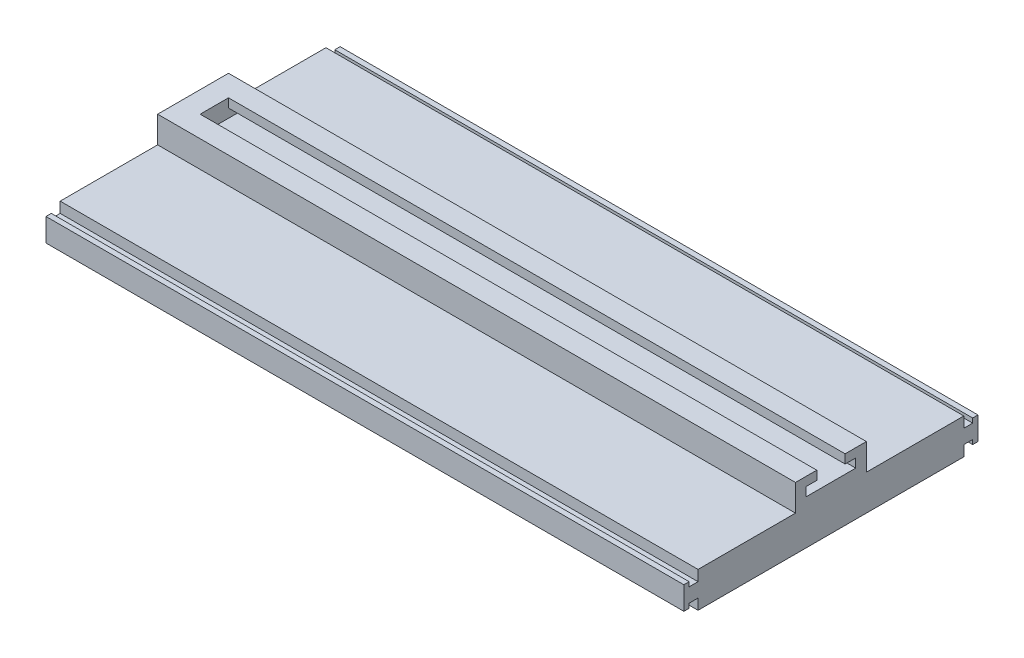
ISO-10303-21;
HEADER;
FILE_DESCRIPTION(('STEP AP214'),'2;1');
FILE_NAME('part.step','',(''),(''),'','','');
FILE_SCHEMA(('AUTOMOTIVE_DESIGN { 1 0 10303 214 1 1 1 1 }'));
ENDSEC;
DATA;
#1=APPLICATION_CONTEXT('core data for automotive mechanical design processes');
#2=APPLICATION_PROTOCOL_DEFINITION('international standard','automotive_design',2000,#1);
#3=PRODUCT_CONTEXT('',#1,'mechanical');
#4=PRODUCT('Part','Part','',(#3));
#5=PRODUCT_RELATED_PRODUCT_CATEGORY('part','',(#4));
#6=PRODUCT_DEFINITION_FORMATION('','',#4);
#7=PRODUCT_DEFINITION_CONTEXT('part definition',#1,'design');
#8=PRODUCT_DEFINITION('design','',#6,#7);
#9=PRODUCT_DEFINITION_SHAPE('','',#8);
#10=(LENGTH_UNIT() NAMED_UNIT(*) SI_UNIT(.MILLI.,.METRE.));
#11=(NAMED_UNIT(*) PLANE_ANGLE_UNIT() SI_UNIT($,.RADIAN.));
#12=(NAMED_UNIT(*) SI_UNIT($,.STERADIAN.) SOLID_ANGLE_UNIT());
#13=UNCERTAINTY_MEASURE_WITH_UNIT(LENGTH_MEASURE(1.E-05),#10,'distance_accuracy_value','');
#14=(GEOMETRIC_REPRESENTATION_CONTEXT(3) GLOBAL_UNCERTAINTY_ASSIGNED_CONTEXT((#13)) GLOBAL_UNIT_ASSIGNED_CONTEXT((#10,
#11,#12)) REPRESENTATION_CONTEXT('',''));
#15=CARTESIAN_POINT('',(0.,0.,0.));
#16=DIRECTION('',(0.,0.,1.));
#17=DIRECTION('',(1.,0.,0.));
#18=AXIS2_PLACEMENT_3D('',#15,#16,#17);
#19=CARTESIAN_POINT('',(228.6,25.4,95.25));
#20=DIRECTION('',(-1.,0.,0.));
#21=DIRECTION('',(0.,0.,1.));
#22=AXIS2_PLACEMENT_3D('',#19,#20,#21);
#23=PLANE('',#22);
#24=DIRECTION('',(0.,-1.,0.));
#25=VECTOR('',#24,1.);
#26=CARTESIAN_POINT('',(228.6,31.75,-17.78));
#27=LINE('',#26,#25);
#28=CARTESIAN_POINT('',(228.6,38.1,-17.78));
#29=VERTEX_POINT('',#28);
#30=CARTESIAN_POINT('',(228.6,31.75,-17.78));
#31=VERTEX_POINT('',#30);
#32=EDGE_CURVE('E301',#29,#31,#27,.T.);
#33=ORIENTED_EDGE('',*,*,#32,.T.);
#34=DIRECTION('',(0.,0.,1.));
#35=VECTOR('',#34,1.);
#36=CARTESIAN_POINT('',(228.6,31.75,-10.1600000000002));
#37=LINE('',#36,#35);
#38=CARTESIAN_POINT('',(228.6,31.75,17.78));
#39=VERTEX_POINT('',#38);
#40=EDGE_CURVE('E320',#31,#39,#37,.T.);
#41=ORIENTED_EDGE('',*,*,#40,.T.);
#42=DIRECTION('',(0.,-1.,0.));
#43=VECTOR('',#42,1.);
#44=CARTESIAN_POINT('',(228.6,31.75,17.78));
#45=LINE('',#44,#43);
#46=CARTESIAN_POINT('',(228.6,38.1,17.78));
#47=VERTEX_POINT('',#46);
#48=EDGE_CURVE('E284',#47,#39,#45,.T.);
#49=ORIENTED_EDGE('',*,*,#48,.F.);
#50=DIRECTION('',(0.,0.,1.));
#51=VECTOR('',#50,1.);
#52=CARTESIAN_POINT('',(228.6,38.1,-17.78));
#53=LINE('',#52,#51);
#54=CARTESIAN_POINT('',(228.6,38.1,10.16));
#55=VERTEX_POINT('',#54);
#56=EDGE_CURVE('E311',#55,#47,#53,.T.);
#57=ORIENTED_EDGE('',*,*,#56,.F.);
#58=DIRECTION('',(0.,1.,0.));
#59=VECTOR('',#58,1.);
#60=CARTESIAN_POINT('',(228.6,31.75,10.16));
#61=LINE('',#60,#59);
#62=CARTESIAN_POINT('',(228.6,44.45,10.16));
#63=VERTEX_POINT('',#62);
#64=EDGE_CURVE('E338',#55,#63,#61,.T.);
#65=ORIENTED_EDGE('',*,*,#64,.T.);
#66=DIRECTION('',(0.,0.,-1.));
#67=VECTOR('',#66,1.);
#68=CARTESIAN_POINT('',(228.6,44.45,25.4));
#69=LINE('',#68,#67);
#70=CARTESIAN_POINT('',(228.6,44.45,25.4));
#71=VERTEX_POINT('',#70);
#72=EDGE_CURVE('E348',#71,#63,#69,.T.);
#73=ORIENTED_EDGE('',*,*,#72,.F.);
#74=DIRECTION('',(0.,-1.,0.));
#75=VECTOR('',#74,1.);
#76=CARTESIAN_POINT('',(228.6,44.45,25.4));
#77=LINE('',#76,#75);
#78=CARTESIAN_POINT('',(228.6,25.4,25.4));
#79=VERTEX_POINT('',#78);
#80=EDGE_CURVE('E363',#71,#79,#77,.T.);
#81=ORIENTED_EDGE('',*,*,#80,.T.);
#82=DIRECTION('',(0.,0.,-1.));
#83=VECTOR('',#82,1.);
#84=CARTESIAN_POINT('',(228.6,25.4,95.25));
#85=LINE('',#84,#83);
#86=CARTESIAN_POINT('',(228.6,25.4,95.25));
#87=VERTEX_POINT('',#86);
#88=EDGE_CURVE('E480',#87,#79,#85,.T.);
#89=ORIENTED_EDGE('',*,*,#88,.F.);
#90=DIRECTION('',(0.,-1.,0.));
#91=VECTOR('',#90,1.);
#92=CARTESIAN_POINT('',(228.6,25.4,95.25));
#93=LINE('',#92,#91);
#94=CARTESIAN_POINT('',(228.6,17.7799999999999,95.25));
#95=VERTEX_POINT('',#94);
#96=EDGE_CURVE('E501',#87,#95,#93,.T.);
#97=ORIENTED_EDGE('',*,*,#96,.T.);
#98=DIRECTION('',(0.,0.,-1.));
#99=VECTOR('',#98,1.);
#100=CARTESIAN_POINT('',(228.6,17.78,105.41));
#101=LINE('',#100,#99);
#102=CARTESIAN_POINT('',(228.6,17.78,101.6));
#103=VERTEX_POINT('',#102);
#104=EDGE_CURVE('E469',#103,#95,#101,.T.);
#105=ORIENTED_EDGE('',*,*,#104,.F.);
#106=DIRECTION('',(0.,1.,0.));
#107=VECTOR('',#106,1.);
#108=CARTESIAN_POINT('',(228.6,4.445,101.6));
#109=LINE('',#108,#107);
#110=CARTESIAN_POINT('',(228.6,20.955,101.6));
#111=VERTEX_POINT('',#110);
#112=EDGE_CURVE('E443',#103,#111,#109,.T.);
#113=ORIENTED_EDGE('',*,*,#112,.T.);
#114=DIRECTION('',(0.,0.,-1.));
#115=VECTOR('',#114,1.);
#116=CARTESIAN_POINT('',(228.6,20.955,105.41));
#117=LINE('',#116,#115);
#118=CARTESIAN_POINT('',(228.6,20.955,105.41));
#119=VERTEX_POINT('',#118);
#120=EDGE_CURVE('E425',#119,#111,#117,.T.);
#121=ORIENTED_EDGE('',*,*,#120,.F.);
#122=DIRECTION('',(0.,1.,0.));
#123=VECTOR('',#122,1.);
#124=CARTESIAN_POINT('',(228.6,17.78,105.41));
#125=LINE('',#124,#123);
#126=CARTESIAN_POINT('',(228.6,4.445,105.41));
#127=VERTEX_POINT('',#126);
#128=EDGE_CURVE('E454',#127,#119,#125,.T.);
#129=ORIENTED_EDGE('',*,*,#128,.F.);
#130=DIRECTION('',(0.,0.,-1.));
#131=VECTOR('',#130,1.);
#132=CARTESIAN_POINT('',(228.6,4.445,105.41));
#133=LINE('',#132,#131);
#134=CARTESIAN_POINT('',(228.6,4.445,101.6));
#135=VERTEX_POINT('',#134);
#136=EDGE_CURVE('E437',#127,#135,#133,.T.);
#137=ORIENTED_EDGE('',*,*,#136,.T.);
#138=CARTESIAN_POINT('',(228.6,7.62,101.6));
#139=VERTEX_POINT('',#138);
#140=EDGE_CURVE('E448',#135,#139,#109,.T.);
#141=ORIENTED_EDGE('',*,*,#140,.T.);
#142=DIRECTION('',(0.,0.,-1.));
#143=VECTOR('',#142,1.);
#144=CARTESIAN_POINT('',(228.6,7.62,105.41));
#145=LINE('',#144,#143);
#146=CARTESIAN_POINT('',(228.6,7.61999999999997,95.25));
#147=VERTEX_POINT('',#146);
#148=EDGE_CURVE('E459',#139,#147,#145,.T.);
#149=ORIENTED_EDGE('',*,*,#148,.T.);
#150=CARTESIAN_POINT('',(228.6,0.,95.25));
#151=VERTEX_POINT('',#150);
#152=EDGE_CURVE('E504',#147,#151,#93,.T.);
#153=ORIENTED_EDGE('',*,*,#152,.T.);
#154=DIRECTION('',(0.,0.,-1.));
#155=VECTOR('',#154,1.);
#156=CARTESIAN_POINT('',(228.6,0.,95.25));
#157=LINE('',#156,#155);
#158=CARTESIAN_POINT('',(228.6,0.,-95.25));
#159=VERTEX_POINT('',#158);
#160=EDGE_CURVE('E490',#151,#159,#157,.T.);
#161=ORIENTED_EDGE('',*,*,#160,.T.);
#162=DIRECTION('',(0.,-1.,0.));
#163=VECTOR('',#162,1.);
#164=CARTESIAN_POINT('',(228.6,25.4,-95.25));
#165=LINE('',#164,#163);
#166=CARTESIAN_POINT('',(228.6,7.61999999999997,-95.25));
#167=VERTEX_POINT('',#166);
#168=EDGE_CURVE('E508',#167,#159,#165,.T.);
#169=ORIENTED_EDGE('',*,*,#168,.F.);
#170=DIRECTION('',(0.,0.,1.));
#171=VECTOR('',#170,1.);
#172=CARTESIAN_POINT('',(228.6,7.62,-105.41));
#173=LINE('',#172,#171);
#174=CARTESIAN_POINT('',(228.6,7.62,-101.6));
#175=VERTEX_POINT('',#174);
#176=EDGE_CURVE('E417',#175,#167,#173,.T.);
#177=ORIENTED_EDGE('',*,*,#176,.F.);
#178=DIRECTION('',(0.,1.,0.));
#179=VECTOR('',#178,1.);
#180=CARTESIAN_POINT('',(228.6,4.445,-101.6));
#181=LINE('',#180,#179);
#182=CARTESIAN_POINT('',(228.6,4.445,-101.6));
#183=VERTEX_POINT('',#182);
#184=EDGE_CURVE('E392',#183,#175,#181,.T.);
#185=ORIENTED_EDGE('',*,*,#184,.F.);
#186=DIRECTION('',(0.,0.,1.));
#187=VECTOR('',#186,1.);
#188=CARTESIAN_POINT('',(228.6,4.445,-105.41));
#189=LINE('',#188,#187);
#190=CARTESIAN_POINT('',(228.6,4.445,-105.41));
#191=VERTEX_POINT('',#190);
#192=EDGE_CURVE('E386',#191,#183,#189,.T.);
#193=ORIENTED_EDGE('',*,*,#192,.F.);
#194=DIRECTION('',(0.,1.,0.));
#195=VECTOR('',#194,1.);
#196=CARTESIAN_POINT('',(228.6,17.78,-105.41));
#197=LINE('',#196,#195);
#198=CARTESIAN_POINT('',(228.6,20.955,-105.41));
#199=VERTEX_POINT('',#198);
#200=EDGE_CURVE('E402',#191,#199,#197,.T.);
#201=ORIENTED_EDGE('',*,*,#200,.T.);
#202=DIRECTION('',(0.,0.,1.));
#203=VECTOR('',#202,1.);
#204=CARTESIAN_POINT('',(228.6,20.955,-105.41));
#205=LINE('',#204,#203);
#206=CARTESIAN_POINT('',(228.6,20.955,-101.6));
#207=VERTEX_POINT('',#206);
#208=EDGE_CURVE('E375',#199,#207,#205,.T.);
#209=ORIENTED_EDGE('',*,*,#208,.T.);
#210=CARTESIAN_POINT('',(228.6,17.7799999999999,-101.6));
#211=VERTEX_POINT('',#210);
#212=EDGE_CURVE('E395',#211,#207,#181,.T.);
#213=ORIENTED_EDGE('',*,*,#212,.F.);
#214=DIRECTION('',(0.,0.,1.));
#215=VECTOR('',#214,1.);
#216=CARTESIAN_POINT('',(228.6,17.78,-105.41));
#217=LINE('',#216,#215);
#218=CARTESIAN_POINT('',(228.6,17.78,-95.25));
#219=VERTEX_POINT('',#218);
#220=EDGE_CURVE('E407',#211,#219,#217,.T.);
#221=ORIENTED_EDGE('',*,*,#220,.T.);
#222=CARTESIAN_POINT('',(228.6,25.4,-95.25));
#223=VERTEX_POINT('',#222);
#224=EDGE_CURVE('E505',#223,#219,#165,.T.);
#225=ORIENTED_EDGE('',*,*,#224,.F.);
#226=CARTESIAN_POINT('',(228.6,25.4,-25.4000000000001));
#227=VERTEX_POINT('',#226);
#228=EDGE_CURVE('E479',#227,#223,#85,.T.);
#229=ORIENTED_EDGE('',*,*,#228,.F.);
#230=DIRECTION('',(0.,-1.,0.));
#231=VECTOR('',#230,1.);
#232=CARTESIAN_POINT('',(228.6,44.45,-25.4000000000002));
#233=LINE('',#232,#231);
#234=CARTESIAN_POINT('',(228.6,44.45,-25.4000000000002));
#235=VERTEX_POINT('',#234);
#236=EDGE_CURVE('E360',#235,#227,#233,.T.);
#237=ORIENTED_EDGE('',*,*,#236,.F.);
#238=CARTESIAN_POINT('',(228.6,44.45,-10.1600000000001));
#239=VERTEX_POINT('',#238);
#240=EDGE_CURVE('E347',#239,#235,#69,.T.);
#241=ORIENTED_EDGE('',*,*,#240,.F.);
#242=DIRECTION('',(0.,1.,0.));
#243=VECTOR('',#242,1.);
#244=CARTESIAN_POINT('',(228.6,31.75,-10.1600000000002));
#245=LINE('',#244,#243);
#246=CARTESIAN_POINT('',(228.6,38.1,-10.1600000000002));
#247=VERTEX_POINT('',#246);
#248=EDGE_CURVE('E325',#247,#239,#245,.T.);
#249=ORIENTED_EDGE('',*,*,#248,.F.);
#250=EDGE_CURVE('E312',#29,#247,#53,.T.);
#251=ORIENTED_EDGE('',*,*,#250,.F.);
#252=EDGE_LOOP('',(#33,#41,#49,#57,#65,#73,#81,#89,#97,#105,#113,#121,#129,#137,#141,#149,#153,
#161,#169,#177,#185,#193,#201,#209,#213,#221,#225,#229,#237,#241,#249,#251));
#253=FACE_BOUND('',#252,.T.);
#254=ADVANCED_FACE('F37',(#253),#23,.F.);
#255=CARTESIAN_POINT('',(228.6,31.75,10.16));
#256=DIRECTION('',(0.,0.,-1.));
#257=DIRECTION('',(-1.,0.,0.));
#258=AXIS2_PLACEMENT_3D('',#255,#256,#257);
#259=PLANE('',#258);
#260=ORIENTED_EDGE('',*,*,#64,.F.);
#261=DIRECTION('',(-1.,0.,0.));
#262=VECTOR('',#261,1.);
#263=CARTESIAN_POINT('',(228.6,38.1,10.16));
#264=LINE('',#263,#262);
#265=CARTESIAN_POINT('',(-213.36,38.1,10.1600000000001));
#266=VERTEX_POINT('',#265);
#267=EDGE_CURVE('E317',#55,#266,#264,.T.);
#268=ORIENTED_EDGE('',*,*,#267,.T.);
#269=DIRECTION('',(0.,1.,0.));
#270=VECTOR('',#269,1.);
#271=CARTESIAN_POINT('',(-213.36,31.75,10.1600000000001));
#272=LINE('',#271,#270);
#273=CARTESIAN_POINT('',(-213.36,44.45,10.1600000000001));
#274=VERTEX_POINT('',#273);
#275=EDGE_CURVE('E336',#266,#274,#272,.T.);
#276=ORIENTED_EDGE('',*,*,#275,.T.);
#277=DIRECTION('',(-1.,0.,0.));
#278=VECTOR('',#277,1.);
#279=CARTESIAN_POINT('',(228.6,44.45,10.16));
#280=LINE('',#279,#278);
#281=EDGE_CURVE('E319',#63,#274,#280,.T.);
#282=ORIENTED_EDGE('',*,*,#281,.F.);
#283=EDGE_LOOP('',(#260,#268,#276,#282));
#284=FACE_BOUND('',#283,.T.);
#285=ADVANCED_FACE('F648',(#284),#259,.T.);
#286=CARTESIAN_POINT('',(228.6,31.75,-10.1600000000002));
#287=DIRECTION('',(0.,0.,-1.));
#288=DIRECTION('',(-1.,0.,0.));
#289=AXIS2_PLACEMENT_3D('',#286,#287,#288);
#290=PLANE('',#289);
#291=DIRECTION('',(-1.,0.,0.));
#292=VECTOR('',#291,1.);
#293=CARTESIAN_POINT('',(228.6,38.1,-10.1600000000002));
#294=LINE('',#293,#292);
#295=CARTESIAN_POINT('',(-213.36,38.1,-10.1600000000001));
#296=VERTEX_POINT('',#295);
#297=EDGE_CURVE('E11',#247,#296,#294,.T.);
#298=ORIENTED_EDGE('',*,*,#297,.F.);
#299=ORIENTED_EDGE('',*,*,#248,.T.);
#300=DIRECTION('',(-1.,0.,0.));
#301=VECTOR('',#300,1.);
#302=CARTESIAN_POINT('',(228.6,44.45,-10.1600000000002));
#303=LINE('',#302,#301);
#304=CARTESIAN_POINT('',(-213.36,44.45,-10.1600000000001));
#305=VERTEX_POINT('',#304);
#306=EDGE_CURVE('E323',#239,#305,#303,.T.);
#307=ORIENTED_EDGE('',*,*,#306,.T.);
#308=DIRECTION('',(0.,1.,0.));
#309=VECTOR('',#308,1.);
#310=CARTESIAN_POINT('',(-213.36,31.75,-10.1600000000001));
#311=LINE('',#310,#309);
#312=EDGE_CURVE('E334',#296,#305,#311,.T.);
#313=ORIENTED_EDGE('',*,*,#312,.F.);
#314=EDGE_LOOP('',(#298,#299,#307,#313));
#315=FACE_BOUND('',#314,.T.);
#316=ADVANCED_FACE('F624',(#315),#290,.F.);
#317=CARTESIAN_POINT('',(0.,44.45,0.));
#318=DIRECTION('',(0.,-1.,0.));
#319=DIRECTION('',(0.,0.,-1.));
#320=AXIS2_PLACEMENT_3D('',#317,#318,#319);
#321=PLANE('',#320);
#322=ORIENTED_EDGE('',*,*,#281,.T.);
#323=DIRECTION('',(0.,0.,1.));
#324=VECTOR('',#323,1.);
#325=CARTESIAN_POINT('',(-213.36,44.45,-10.1600000000001));
#326=LINE('',#325,#324);
#327=EDGE_CURVE('E328',#305,#274,#326,.T.);
#328=ORIENTED_EDGE('',*,*,#327,.F.);
#329=ORIENTED_EDGE('',*,*,#306,.F.);
#330=ORIENTED_EDGE('',*,*,#240,.T.);
#331=DIRECTION('',(-1.,0.,0.));
#332=VECTOR('',#331,1.);
#333=CARTESIAN_POINT('',(-228.6,44.45,-25.4));
#334=LINE('',#333,#332);
#335=CARTESIAN_POINT('',(-228.6,44.45,-25.4));
#336=VERTEX_POINT('',#335);
#337=EDGE_CURVE('E351',#235,#336,#334,.T.);
#338=ORIENTED_EDGE('',*,*,#337,.T.);
#339=DIRECTION('',(0.,0.,1.));
#340=VECTOR('',#339,1.);
#341=CARTESIAN_POINT('',(-228.6,44.45,25.4));
#342=LINE('',#341,#340);
#343=CARTESIAN_POINT('',(-228.6,44.45,25.4));
#344=VERTEX_POINT('',#343);
#345=EDGE_CURVE('E341',#336,#344,#342,.T.);
#346=ORIENTED_EDGE('',*,*,#345,.T.);
#347=DIRECTION('',(1.,0.,0.));
#348=VECTOR('',#347,1.);
#349=CARTESIAN_POINT('',(-228.6,44.45,25.4));
#350=LINE('',#349,#348);
#351=EDGE_CURVE('E344',#344,#71,#350,.T.);
#352=ORIENTED_EDGE('',*,*,#351,.T.);
#353=ORIENTED_EDGE('',*,*,#72,.T.);
#354=EDGE_LOOP('',(#322,#328,#329,#330,#338,#346,#352,#353));
#355=FACE_BOUND('',#354,.T.);
#356=ADVANCED_FACE('F611',(#355),#321,.F.);
#357=CARTESIAN_POINT('',(0.,25.4,0.));
#358=DIRECTION('',(0.,-1.,0.));
#359=DIRECTION('',(0.,0.,-1.));
#360=AXIS2_PLACEMENT_3D('',#357,#358,#359);
#361=PLANE('',#360);
#362=DIRECTION('',(-1.,0.,0.));
#363=VECTOR('',#362,1.);
#364=CARTESIAN_POINT('',(-228.6,25.4,-25.4));
#365=LINE('',#364,#363);
#366=CARTESIAN_POINT('',(-228.6,25.4,-25.4000000000001));
#367=VERTEX_POINT('',#366);
#368=EDGE_CURVE('E345',#227,#367,#365,.T.);
#369=ORIENTED_EDGE('',*,*,#368,.F.);
#370=ORIENTED_EDGE('',*,*,#228,.T.);
#371=DIRECTION('',(1.,0.,0.));
#372=VECTOR('',#371,1.);
#373=CARTESIAN_POINT('',(-228.6,25.4,-95.25));
#374=LINE('',#373,#372);
#375=CARTESIAN_POINT('',(-228.6,25.4,-95.25));
#376=VERTEX_POINT('',#375);
#377=EDGE_CURVE('E475',#376,#223,#374,.T.);
#378=ORIENTED_EDGE('',*,*,#377,.F.);
#379=DIRECTION('',(0.,0.,-1.));
#380=VECTOR('',#379,1.);
#381=CARTESIAN_POINT('',(-228.6,25.4,95.25));
#382=LINE('',#381,#380);
#383=EDGE_CURVE('E476',#367,#376,#382,.T.);
#384=ORIENTED_EDGE('',*,*,#383,.F.);
#385=EDGE_LOOP('',(#369,#370,#378,#384));
#386=FACE_BOUND('',#385,.T.);
#387=ADVANCED_FACE('F528',(#386),#361,.F.);
#388=DIRECTION('',(1.,0.,0.));
#389=VECTOR('',#388,1.);
#390=CARTESIAN_POINT('',(-228.6,25.4,25.4));
#391=LINE('',#390,#389);
#392=CARTESIAN_POINT('',(-228.6,25.4,25.4));
#393=VERTEX_POINT('',#392);
#394=EDGE_CURVE('E340',#393,#79,#391,.T.);
#395=ORIENTED_EDGE('',*,*,#394,.F.);
#396=CARTESIAN_POINT('',(-228.6,25.4,95.25));
#397=VERTEX_POINT('',#396);
#398=EDGE_CURVE('E472',#397,#393,#382,.T.);
#399=ORIENTED_EDGE('',*,*,#398,.F.);
#400=DIRECTION('',(1.,0.,0.));
#401=VECTOR('',#400,1.);
#402=CARTESIAN_POINT('',(-228.6,25.4,95.25));
#403=LINE('',#402,#401);
#404=EDGE_CURVE('E482',#397,#87,#403,.T.);
#405=ORIENTED_EDGE('',*,*,#404,.T.);
#406=ORIENTED_EDGE('',*,*,#88,.T.);
#407=EDGE_LOOP('',(#395,#399,#405,#406));
#408=FACE_BOUND('',#407,.T.);
#409=ADVANCED_FACE('F678',(#408),#361,.F.);
#410=CARTESIAN_POINT('',(228.6,7.62,-105.41));
#411=DIRECTION('',(0.,-1.,0.));
#412=DIRECTION('',(1.,0.,0.));
#413=AXIS2_PLACEMENT_3D('',#410,#411,#412);
#414=PLANE('',#413);
#415=DIRECTION('',(0.,0.,1.));
#416=VECTOR('',#415,1.);
#417=CARTESIAN_POINT('',(-228.6,7.61999999999995,-105.41));
#418=LINE('',#417,#416);
#419=CARTESIAN_POINT('',(-228.6,7.61999999999998,-101.6));
#420=VERTEX_POINT('',#419);
#421=CARTESIAN_POINT('',(-228.6,7.61999999999995,-95.25));
#422=VERTEX_POINT('',#421);
#423=EDGE_CURVE('E415',#420,#422,#418,.T.);
#424=ORIENTED_EDGE('',*,*,#423,.F.);
#425=DIRECTION('',(1.,0.,0.));
#426=VECTOR('',#425,1.);
#427=CARTESIAN_POINT('',(228.6,7.62,-101.6));
#428=LINE('',#427,#426);
#429=EDGE_CURVE('E394',#420,#175,#428,.T.);
#430=ORIENTED_EDGE('',*,*,#429,.T.);
#431=ORIENTED_EDGE('',*,*,#176,.T.);
#432=DIRECTION('',(1.,0.,0.));
#433=VECTOR('',#432,1.);
#434=CARTESIAN_POINT('',(228.6,7.62,-95.25));
#435=LINE('',#434,#433);
#436=EDGE_CURVE('E401',#422,#167,#435,.T.);
#437=ORIENTED_EDGE('',*,*,#436,.F.);
#438=EDGE_LOOP('',(#424,#430,#431,#437));
#439=FACE_BOUND('',#438,.T.);
#440=ADVANCED_FACE('F554',(#439),#414,.T.);
#441=CARTESIAN_POINT('',(228.6,17.78,-105.41));
#442=DIRECTION('',(0.,1.,0.));
#443=DIRECTION('',(-1.,0.,0.));
#444=AXIS2_PLACEMENT_3D('',#441,#442,#443);
#445=PLANE('',#444);
#446=ORIENTED_EDGE('',*,*,#220,.F.);
#447=DIRECTION('',(-1.,0.,0.));
#448=VECTOR('',#447,1.);
#449=CARTESIAN_POINT('',(228.6,17.78,-101.6));
#450=LINE('',#449,#448);
#451=CARTESIAN_POINT('',(-228.6,17.7799999999998,-101.6));
#452=VERTEX_POINT('',#451);
#453=EDGE_CURVE('E45',#211,#452,#450,.T.);
#454=ORIENTED_EDGE('',*,*,#453,.T.);
#455=DIRECTION('',(0.,0.,1.));
#456=VECTOR('',#455,1.);
#457=CARTESIAN_POINT('',(-228.6,17.7799999999998,-105.41));
#458=LINE('',#457,#456);
#459=CARTESIAN_POINT('',(-228.6,17.7799999999998,-95.25));
#460=VERTEX_POINT('',#459);
#461=EDGE_CURVE('E413',#452,#460,#458,.T.);
#462=ORIENTED_EDGE('',*,*,#461,.T.);
#463=DIRECTION('',(-1.,0.,0.));
#464=VECTOR('',#463,1.);
#465=CARTESIAN_POINT('',(228.6,17.78,-95.25));
#466=LINE('',#465,#464);
#467=EDGE_CURVE('E405',#219,#460,#466,.T.);
#468=ORIENTED_EDGE('',*,*,#467,.F.);
#469=EDGE_LOOP('',(#446,#454,#462,#468));
#470=FACE_BOUND('',#469,.T.);
#471=ADVANCED_FACE('F517',(#470),#445,.T.);
#472=CARTESIAN_POINT('',(-228.6,25.4,-95.25));
#473=DIRECTION('',(0.,0.,-1.));
#474=DIRECTION('',(-1.,0.,0.));
#475=AXIS2_PLACEMENT_3D('',#472,#473,#474);
#476=PLANE('',#475);
#477=ORIENTED_EDGE('',*,*,#224,.T.);
#478=ORIENTED_EDGE('',*,*,#467,.T.);
#479=DIRECTION('',(0.,-1.,0.));
#480=VECTOR('',#479,1.);
#481=CARTESIAN_POINT('',(-228.6,25.4,-95.25));
#482=LINE('',#481,#480);
#483=EDGE_CURVE('E509',#376,#460,#482,.T.);
#484=ORIENTED_EDGE('',*,*,#483,.F.);
#485=ORIENTED_EDGE('',*,*,#377,.T.);
#486=EDGE_LOOP('',(#477,#478,#484,#485));
#487=FACE_BOUND('',#486,.T.);
#488=ADVANCED_FACE('F526',(#487),#476,.T.);
#489=CARTESIAN_POINT('',(-228.6,0.,-95.25));
#490=VERTEX_POINT('',#489);
#491=EDGE_CURVE('E484',#422,#490,#482,.T.);
#492=ORIENTED_EDGE('',*,*,#491,.F.);
#493=ORIENTED_EDGE('',*,*,#436,.T.);
#494=ORIENTED_EDGE('',*,*,#168,.T.);
#495=DIRECTION('',(1.,0.,0.));
#496=VECTOR('',#495,1.);
#497=CARTESIAN_POINT('',(-228.6,0.,-95.25));
#498=LINE('',#497,#496);
#499=EDGE_CURVE('E487',#490,#159,#498,.T.);
#500=ORIENTED_EDGE('',*,*,#499,.F.);
#501=EDGE_LOOP('',(#492,#493,#494,#500));
#502=FACE_BOUND('',#501,.T.);
#503=ADVANCED_FACE('F560',(#502),#476,.T.);
#504=CARTESIAN_POINT('',(-228.6,25.4,95.25));
#505=DIRECTION('',(0.,0.,-1.));
#506=DIRECTION('',(-1.,0.,0.));
#507=AXIS2_PLACEMENT_3D('',#504,#505,#506);
#508=PLANE('',#507);
#509=DIRECTION('',(1.,0.,0.));
#510=VECTOR('',#509,1.);
#511=CARTESIAN_POINT('',(228.6,7.62,95.25));
#512=LINE('',#511,#510);
#513=CARTESIAN_POINT('',(-228.6,7.61999999999997,95.25));
#514=VERTEX_POINT('',#513);
#515=EDGE_CURVE('E457',#514,#147,#512,.T.);
#516=ORIENTED_EDGE('',*,*,#515,.F.);
#517=DIRECTION('',(0.,-1.,0.));
#518=VECTOR('',#517,1.);
#519=CARTESIAN_POINT('',(-228.6,25.4,95.25));
#520=LINE('',#519,#518);
#521=CARTESIAN_POINT('',(-228.6,0.,95.25));
#522=VERTEX_POINT('',#521);
#523=EDGE_CURVE('E500',#514,#522,#520,.T.);
#524=ORIENTED_EDGE('',*,*,#523,.T.);
#525=DIRECTION('',(1.,0.,0.));
#526=VECTOR('',#525,1.);
#527=CARTESIAN_POINT('',(-228.6,0.,95.25));
#528=LINE('',#527,#526);
#529=EDGE_CURVE('E493',#522,#151,#528,.T.);
#530=ORIENTED_EDGE('',*,*,#529,.T.);
#531=ORIENTED_EDGE('',*,*,#152,.F.);
#532=EDGE_LOOP('',(#516,#524,#530,#531));
#533=FACE_BOUND('',#532,.T.);
#534=ADVANCED_FACE('F569',(#533),#508,.F.);
#535=DIRECTION('',(-1.,0.,0.));
#536=VECTOR('',#535,1.);
#537=CARTESIAN_POINT('',(228.6,17.78,95.25));
#538=LINE('',#537,#536);
#539=CARTESIAN_POINT('',(-228.6,17.7799999999998,95.25));
#540=VERTEX_POINT('',#539);
#541=EDGE_CURVE('E453',#95,#540,#538,.T.);
#542=ORIENTED_EDGE('',*,*,#541,.F.);
#543=ORIENTED_EDGE('',*,*,#96,.F.);
#544=ORIENTED_EDGE('',*,*,#404,.F.);
#545=EDGE_CURVE('E496',#397,#540,#520,.T.);
#546=ORIENTED_EDGE('',*,*,#545,.T.);
#547=EDGE_LOOP('',(#542,#543,#544,#546));
#548=FACE_BOUND('',#547,.T.);
#549=ADVANCED_FACE('F601',(#548),#508,.F.);
#550=CARTESIAN_POINT('',(-228.6,25.4,95.25));
#551=DIRECTION('',(-1.,0.,0.));
#552=DIRECTION('',(0.,0.,1.));
#553=AXIS2_PLACEMENT_3D('',#550,#551,#552);
#554=PLANE('',#553);
#555=DIRECTION('',(0.,1.,0.));
#556=VECTOR('',#555,1.);
#557=CARTESIAN_POINT('',(-228.6,4.44499999999978,-101.6));
#558=LINE('',#557,#556);
#559=CARTESIAN_POINT('',(-228.6,4.44499999999978,-101.6));
#560=VERTEX_POINT('',#559);
#561=EDGE_CURVE('E396',#560,#420,#558,.T.);
#562=ORIENTED_EDGE('',*,*,#561,.T.);
#563=ORIENTED_EDGE('',*,*,#423,.T.);
#564=ORIENTED_EDGE('',*,*,#491,.T.);
#565=DIRECTION('',(0.,0.,-1.));
#566=VECTOR('',#565,1.);
#567=CARTESIAN_POINT('',(-228.6,0.,95.25));
#568=LINE('',#567,#566);
#569=EDGE_CURVE('E471',#522,#490,#568,.T.);
#570=ORIENTED_EDGE('',*,*,#569,.F.);
#571=ORIENTED_EDGE('',*,*,#523,.F.);
#572=DIRECTION('',(0.,0.,-1.));
#573=VECTOR('',#572,1.);
#574=CARTESIAN_POINT('',(-228.6,7.61999999999995,105.41));
#575=LINE('',#574,#573);
#576=CARTESIAN_POINT('',(-228.6,7.61999999999998,101.6));
#577=VERTEX_POINT('',#576);
#578=EDGE_CURVE('E465',#577,#514,#575,.T.);
#579=ORIENTED_EDGE('',*,*,#578,.F.);
#580=DIRECTION('',(0.,1.,0.));
#581=VECTOR('',#580,1.);
#582=CARTESIAN_POINT('',(-228.6,4.44499999999978,101.6));
#583=LINE('',#582,#581);
#584=CARTESIAN_POINT('',(-228.6,4.44499999999978,101.6));
#585=VERTEX_POINT('',#584);
#586=EDGE_CURVE('E444',#585,#577,#583,.T.);
#587=ORIENTED_EDGE('',*,*,#586,.F.);
#588=DIRECTION('',(0.,0.,1.));
#589=VECTOR('',#588,1.);
#590=CARTESIAN_POINT('',(-228.6,4.44499999999978,105.41));
#591=LINE('',#590,#589);
#592=CARTESIAN_POINT('',(-228.6,4.44499999999978,105.41));
#593=VERTEX_POINT('',#592);
#594=EDGE_CURVE('E431',#585,#593,#591,.T.);
#595=ORIENTED_EDGE('',*,*,#594,.T.);
#596=DIRECTION('',(0.,-1.,0.));
#597=VECTOR('',#596,1.);
#598=CARTESIAN_POINT('',(-228.6,17.7799999999998,105.41));
#599=LINE('',#598,#597);
#600=CARTESIAN_POINT('',(-228.6,20.9549999999998,105.41));
#601=VERTEX_POINT('',#600);
#602=EDGE_CURVE('E456',#601,#593,#599,.T.);
#603=ORIENTED_EDGE('',*,*,#602,.F.);
#604=DIRECTION('',(0.,0.,1.));
#605=VECTOR('',#604,1.);
#606=CARTESIAN_POINT('',(-228.6,20.9549999999998,105.41));
#607=LINE('',#606,#605);
#608=CARTESIAN_POINT('',(-228.6,20.9549999999998,101.6));
#609=VERTEX_POINT('',#608);
#610=EDGE_CURVE('E419',#609,#601,#607,.T.);
#611=ORIENTED_EDGE('',*,*,#610,.F.);
#612=CARTESIAN_POINT('',(-228.6,17.7799999999999,101.6));
#613=VERTEX_POINT('',#612);
#614=EDGE_CURVE('E447',#613,#609,#583,.T.);
#615=ORIENTED_EDGE('',*,*,#614,.F.);
#616=DIRECTION('',(0.,0.,-1.));
#617=VECTOR('',#616,1.);
#618=CARTESIAN_POINT('',(-228.6,17.7799999999998,105.41));
#619=LINE('',#618,#617);
#620=EDGE_CURVE('E467',#613,#540,#619,.T.);
#621=ORIENTED_EDGE('',*,*,#620,.T.);
#622=ORIENTED_EDGE('',*,*,#545,.F.);
#623=ORIENTED_EDGE('',*,*,#398,.T.);
#624=DIRECTION('',(0.,-1.,0.));
#625=VECTOR('',#624,1.);
#626=CARTESIAN_POINT('',(-228.6,44.45,25.4));
#627=LINE('',#626,#625);
#628=EDGE_CURVE('E366',#344,#393,#627,.T.);
#629=ORIENTED_EDGE('',*,*,#628,.F.);
#630=ORIENTED_EDGE('',*,*,#345,.F.);
#631=DIRECTION('',(0.,-1.,0.));
#632=VECTOR('',#631,1.);
#633=CARTESIAN_POINT('',(-228.6,44.45,-25.4));
#634=LINE('',#633,#632);
#635=EDGE_CURVE('E353',#336,#367,#634,.T.);
#636=ORIENTED_EDGE('',*,*,#635,.T.);
#637=ORIENTED_EDGE('',*,*,#383,.T.);
#638=ORIENTED_EDGE('',*,*,#483,.T.);
#639=ORIENTED_EDGE('',*,*,#461,.F.);
#640=CARTESIAN_POINT('',(-228.6,20.9549999999998,-101.6));
#641=VERTEX_POINT('',#640);
#642=EDGE_CURVE('E391',#452,#641,#558,.T.);
#643=ORIENTED_EDGE('',*,*,#642,.T.);
#644=DIRECTION('',(0.,0.,-1.));
#645=VECTOR('',#644,1.);
#646=CARTESIAN_POINT('',(-228.6,20.9549999999998,-105.41));
#647=LINE('',#646,#645);
#648=CARTESIAN_POINT('',(-228.6,20.9549999999998,-105.41));
#649=VERTEX_POINT('',#648);
#650=EDGE_CURVE('E369',#641,#649,#647,.T.);
#651=ORIENTED_EDGE('',*,*,#650,.T.);
#652=DIRECTION('',(0.,-1.,0.));
#653=VECTOR('',#652,1.);
#654=CARTESIAN_POINT('',(-228.6,17.7799999999998,-105.41));
#655=LINE('',#654,#653);
#656=CARTESIAN_POINT('',(-228.6,4.44499999999978,-105.41));
#657=VERTEX_POINT('',#656);
#658=EDGE_CURVE('E404',#649,#657,#655,.T.);
#659=ORIENTED_EDGE('',*,*,#658,.T.);
#660=DIRECTION('',(0.,0.,-1.));
#661=VECTOR('',#660,1.);
#662=CARTESIAN_POINT('',(-228.6,4.44499999999978,-105.41));
#663=LINE('',#662,#661);
#664=EDGE_CURVE('E381',#560,#657,#663,.T.);
#665=ORIENTED_EDGE('',*,*,#664,.F.);
#666=EDGE_LOOP('',(#562,#563,#564,#570,#571,#579,#587,#595,#603,#611,#615,#621,#622,#623,#629,
#630,#636,#637,#638,#639,#643,#651,#659,#665));
#667=FACE_BOUND('',#666,.T.);
#668=ADVANCED_FACE('F39',(#667),#554,.T.);
#669=CARTESIAN_POINT('',(0.,0.,0.));
#670=DIRECTION('',(0.,-1.,0.));
#671=DIRECTION('',(0.,0.,-1.));
#672=AXIS2_PLACEMENT_3D('',#669,#670,#671);
#673=PLANE('',#672);
#674=DIRECTION('',(-1.,0.,0.));
#675=VECTOR('',#674,1.);
#676=CARTESIAN_POINT('',(44.0819420350076,0.,-25.4));
#677=LINE('',#676,#675);
#678=CARTESIAN_POINT('',(44.0819420350076,0.,-25.4));
#679=VERTEX_POINT('',#678);
#680=CARTESIAN_POINT('',(-32.1180579649924,0.,-25.4));
#681=VERTEX_POINT('',#680);
#682=EDGE_CURVE('E281',#679,#681,#677,.T.);
#683=ORIENTED_EDGE('',*,*,#682,.T.);
#684=DIRECTION('',(0.,0.,1.));
#685=VECTOR('',#684,1.);
#686=CARTESIAN_POINT('',(-32.1180579649924,0.,-25.4));
#687=LINE('',#686,#685);
#688=CARTESIAN_POINT('',(-32.1180579649924,0.,25.4));
#689=VERTEX_POINT('',#688);
#690=EDGE_CURVE('E273',#681,#689,#687,.T.);
#691=ORIENTED_EDGE('',*,*,#690,.T.);
#692=DIRECTION('',(-1.,0.,0.));
#693=VECTOR('',#692,1.);
#694=CARTESIAN_POINT('',(44.0819420350076,0.,25.4));
#695=LINE('',#694,#693);
#696=CARTESIAN_POINT('',(44.0819420350076,0.,25.4));
#697=VERTEX_POINT('',#696);
#698=EDGE_CURVE('E262',#697,#689,#695,.T.);
#699=ORIENTED_EDGE('',*,*,#698,.F.);
#700=DIRECTION('',(0.,0.,1.));
#701=VECTOR('',#700,1.);
#702=CARTESIAN_POINT('',(44.0819420350076,0.,-25.4));
#703=LINE('',#702,#701);
#704=EDGE_CURVE('E282',#679,#697,#703,.T.);
#705=ORIENTED_EDGE('',*,*,#704,.F.);
#706=EDGE_LOOP('',(#683,#691,#699,#705));
#707=FACE_BOUND('',#706,.T.);
#708=ORIENTED_EDGE('',*,*,#569,.T.);
#709=ORIENTED_EDGE('',*,*,#499,.T.);
#710=ORIENTED_EDGE('',*,*,#160,.F.);
#711=ORIENTED_EDGE('',*,*,#529,.F.);
#712=EDGE_LOOP('',(#708,#709,#710,#711));
#713=FACE_BOUND('',#712,.T.);
#714=ADVANCED_FACE('F279',(#707,#713),#673,.T.);
#715=CARTESIAN_POINT('',(228.6,17.78,105.41));
#716=DIRECTION('',(0.,-1.,0.));
#717=DIRECTION('',(1.,0.,0.));
#718=AXIS2_PLACEMENT_3D('',#715,#716,#717);
#719=PLANE('',#718);
#720=ORIENTED_EDGE('',*,*,#620,.F.);
#721=DIRECTION('',(1.,0.,0.));
#722=VECTOR('',#721,1.);
#723=CARTESIAN_POINT('',(228.6,17.78,101.6));
#724=LINE('',#723,#722);
#725=EDGE_CURVE('E446',#613,#103,#724,.T.);
#726=ORIENTED_EDGE('',*,*,#725,.T.);
#727=ORIENTED_EDGE('',*,*,#104,.T.);
#728=ORIENTED_EDGE('',*,*,#541,.T.);
#729=EDGE_LOOP('',(#720,#726,#727,#728));
#730=FACE_BOUND('',#729,.T.);
#731=ADVANCED_FACE('F595',(#730),#719,.F.);
#732=CARTESIAN_POINT('',(228.6,7.62,105.41));
#733=DIRECTION('',(0.,1.,0.));
#734=DIRECTION('',(-1.,0.,0.));
#735=AXIS2_PLACEMENT_3D('',#732,#733,#734);
#736=PLANE('',#735);
#737=ORIENTED_EDGE('',*,*,#148,.F.);
#738=DIRECTION('',(-1.,0.,0.));
#739=VECTOR('',#738,1.);
#740=CARTESIAN_POINT('',(228.6,7.62,101.6));
#741=LINE('',#740,#739);
#742=EDGE_CURVE('E499',#139,#577,#741,.T.);
#743=ORIENTED_EDGE('',*,*,#742,.T.);
#744=ORIENTED_EDGE('',*,*,#578,.T.);
#745=ORIENTED_EDGE('',*,*,#515,.T.);
#746=EDGE_LOOP('',(#737,#743,#744,#745));
#747=FACE_BOUND('',#746,.T.);
#748=ADVANCED_FACE('F572',(#747),#736,.F.);
#749=CARTESIAN_POINT('',(0.,0.,105.41));
#750=DIRECTION('',(0.,0.,-1.));
#751=DIRECTION('',(-1.,0.,0.));
#752=AXIS2_PLACEMENT_3D('',#749,#750,#751);
#753=PLANE('',#752);
#754=ORIENTED_EDGE('',*,*,#128,.T.);
#755=DIRECTION('',(1.,0.,0.));
#756=VECTOR('',#755,1.);
#757=CARTESIAN_POINT('',(-228.6,20.9549999999998,105.41));
#758=LINE('',#757,#756);
#759=EDGE_CURVE('E422',#601,#119,#758,.T.);
#760=ORIENTED_EDGE('',*,*,#759,.F.);
#761=ORIENTED_EDGE('',*,*,#602,.T.);
#762=DIRECTION('',(1.,0.,0.));
#763=VECTOR('',#762,1.);
#764=CARTESIAN_POINT('',(-228.6,4.44499999999978,105.41));
#765=LINE('',#764,#763);
#766=EDGE_CURVE('E434',#593,#127,#765,.T.);
#767=ORIENTED_EDGE('',*,*,#766,.T.);
#768=EDGE_LOOP('',(#754,#760,#761,#767));
#769=FACE_BOUND('',#768,.T.);
#770=ADVANCED_FACE('F583',(#769),#753,.F.);
#771=CARTESIAN_POINT('',(0.,4.44499999999989,0.));
#772=DIRECTION('',(0.,-1.,0.));
#773=DIRECTION('',(1.,0.,0.));
#774=AXIS2_PLACEMENT_3D('',#771,#772,#773);
#775=PLANE('',#774);
#776=ORIENTED_EDGE('',*,*,#594,.F.);
#777=DIRECTION('',(-1.,0.,0.));
#778=VECTOR('',#777,1.);
#779=CARTESIAN_POINT('',(-228.6,4.44499999999978,101.6));
#780=LINE('',#779,#778);
#781=EDGE_CURVE('E440',#135,#585,#780,.T.);
#782=ORIENTED_EDGE('',*,*,#781,.F.);
#783=ORIENTED_EDGE('',*,*,#136,.F.);
#784=ORIENTED_EDGE('',*,*,#766,.F.);
#785=EDGE_LOOP('',(#776,#782,#783,#784));
#786=FACE_BOUND('',#785,.T.);
#787=ADVANCED_FACE('F578',(#786),#775,.T.);
#788=CARTESIAN_POINT('',(-228.6,4.44499999999978,101.6));
#789=DIRECTION('',(0.,0.,-1.));
#790=DIRECTION('',(-1.,0.,0.));
#791=AXIS2_PLACEMENT_3D('',#788,#789,#790);
#792=PLANE('',#791);
#793=ORIENTED_EDGE('',*,*,#742,.F.);
#794=ORIENTED_EDGE('',*,*,#140,.F.);
#795=ORIENTED_EDGE('',*,*,#781,.T.);
#796=ORIENTED_EDGE('',*,*,#586,.T.);
#797=EDGE_LOOP('',(#793,#794,#795,#796));
#798=FACE_BOUND('',#797,.T.);
#799=ADVANCED_FACE('F580',(#798),#792,.T.);
#800=ORIENTED_EDGE('',*,*,#725,.F.);
#801=ORIENTED_EDGE('',*,*,#614,.T.);
#802=DIRECTION('',(-1.,0.,0.));
#803=VECTOR('',#802,1.);
#804=CARTESIAN_POINT('',(-228.6,20.9549999999998,101.6));
#805=LINE('',#804,#803);
#806=EDGE_CURVE('E428',#111,#609,#805,.T.);
#807=ORIENTED_EDGE('',*,*,#806,.F.);
#808=ORIENTED_EDGE('',*,*,#112,.F.);
#809=EDGE_LOOP('',(#800,#801,#807,#808));
#810=FACE_BOUND('',#809,.T.);
#811=ADVANCED_FACE('F592',(#810),#792,.T.);
#812=CARTESIAN_POINT('',(0.,20.9549999999999,0.));
#813=DIRECTION('',(0.,-1.,0.));
#814=DIRECTION('',(1.,0.,0.));
#815=AXIS2_PLACEMENT_3D('',#812,#813,#814);
#816=PLANE('',#815);
#817=ORIENTED_EDGE('',*,*,#610,.T.);
#818=ORIENTED_EDGE('',*,*,#759,.T.);
#819=ORIENTED_EDGE('',*,*,#120,.T.);
#820=ORIENTED_EDGE('',*,*,#806,.T.);
#821=EDGE_LOOP('',(#817,#818,#819,#820));
#822=FACE_BOUND('',#821,.T.);
#823=ADVANCED_FACE('F589',(#822),#816,.F.);
#824=CARTESIAN_POINT('',(0.,0.,-105.41));
#825=DIRECTION('',(0.,0.,1.));
#826=DIRECTION('',(-1.,0.,0.));
#827=AXIS2_PLACEMENT_3D('',#824,#825,#826);
#828=PLANE('',#827);
#829=ORIENTED_EDGE('',*,*,#200,.F.);
#830=DIRECTION('',(1.,0.,0.));
#831=VECTOR('',#830,1.);
#832=CARTESIAN_POINT('',(-228.6,4.44499999999978,-105.41));
#833=LINE('',#832,#831);
#834=EDGE_CURVE('E388',#657,#191,#833,.T.);
#835=ORIENTED_EDGE('',*,*,#834,.F.);
#836=ORIENTED_EDGE('',*,*,#658,.F.);
#837=DIRECTION('',(1.,0.,0.));
#838=VECTOR('',#837,1.);
#839=CARTESIAN_POINT('',(-228.6,20.9549999999998,-105.41));
#840=LINE('',#839,#838);
#841=EDGE_CURVE('E378',#649,#199,#840,.T.);
#842=ORIENTED_EDGE('',*,*,#841,.T.);
#843=EDGE_LOOP('',(#829,#835,#836,#842));
#844=FACE_BOUND('',#843,.T.);
#845=ADVANCED_FACE('F542',(#844),#828,.F.);
#846=CARTESIAN_POINT('',(0.,20.9549999999999,0.));
#847=DIRECTION('',(0.,-1.,0.));
#848=DIRECTION('',(1.,0.,0.));
#849=AXIS2_PLACEMENT_3D('',#846,#847,#848);
#850=PLANE('',#849);
#851=ORIENTED_EDGE('',*,*,#650,.F.);
#852=DIRECTION('',(-1.,0.,0.));
#853=VECTOR('',#852,1.);
#854=CARTESIAN_POINT('',(-228.6,20.9549999999998,-101.6));
#855=LINE('',#854,#853);
#856=EDGE_CURVE('E372',#207,#641,#855,.T.);
#857=ORIENTED_EDGE('',*,*,#856,.F.);
#858=ORIENTED_EDGE('',*,*,#208,.F.);
#859=ORIENTED_EDGE('',*,*,#841,.F.);
#860=EDGE_LOOP('',(#851,#857,#858,#859));
#861=FACE_BOUND('',#860,.T.);
#862=ADVANCED_FACE('F537',(#861),#850,.F.);
#863=CARTESIAN_POINT('',(-228.6,4.44499999999978,-101.6));
#864=DIRECTION('',(0.,0.,-1.));
#865=DIRECTION('',(-1.,0.,0.));
#866=AXIS2_PLACEMENT_3D('',#863,#864,#865);
#867=PLANE('',#866);
#868=ORIENTED_EDGE('',*,*,#453,.F.);
#869=ORIENTED_EDGE('',*,*,#212,.T.);
#870=ORIENTED_EDGE('',*,*,#856,.T.);
#871=ORIENTED_EDGE('',*,*,#642,.F.);
#872=EDGE_LOOP('',(#868,#869,#870,#871));
#873=FACE_BOUND('',#872,.T.);
#874=ADVANCED_FACE('F535',(#873),#867,.F.);
#875=ORIENTED_EDGE('',*,*,#429,.F.);
#876=ORIENTED_EDGE('',*,*,#561,.F.);
#877=DIRECTION('',(-1.,0.,0.));
#878=VECTOR('',#877,1.);
#879=CARTESIAN_POINT('',(-228.6,4.44499999999978,-101.6));
#880=LINE('',#879,#878);
#881=EDGE_CURVE('E384',#183,#560,#880,.T.);
#882=ORIENTED_EDGE('',*,*,#881,.F.);
#883=ORIENTED_EDGE('',*,*,#184,.T.);
#884=EDGE_LOOP('',(#875,#876,#882,#883));
#885=FACE_BOUND('',#884,.T.);
#886=ADVANCED_FACE('F550',(#885),#867,.F.);
#887=CARTESIAN_POINT('',(0.,4.44499999999989,0.));
#888=DIRECTION('',(0.,-1.,0.));
#889=DIRECTION('',(1.,0.,0.));
#890=AXIS2_PLACEMENT_3D('',#887,#888,#889);
#891=PLANE('',#890);
#892=ORIENTED_EDGE('',*,*,#664,.T.);
#893=ORIENTED_EDGE('',*,*,#834,.T.);
#894=ORIENTED_EDGE('',*,*,#192,.T.);
#895=ORIENTED_EDGE('',*,*,#881,.T.);
#896=EDGE_LOOP('',(#892,#893,#894,#895));
#897=FACE_BOUND('',#896,.T.);
#898=ADVANCED_FACE('F545',(#897),#891,.T.);
#899=CARTESIAN_POINT('',(-228.6,44.45,25.4));
#900=DIRECTION('',(0.,0.,-1.));
#901=DIRECTION('',(-1.,0.,0.));
#902=AXIS2_PLACEMENT_3D('',#899,#900,#901);
#903=PLANE('',#902);
#904=ORIENTED_EDGE('',*,*,#394,.T.);
#905=ORIENTED_EDGE('',*,*,#80,.F.);
#906=ORIENTED_EDGE('',*,*,#351,.F.);
#907=ORIENTED_EDGE('',*,*,#628,.T.);
#908=EDGE_LOOP('',(#904,#905,#906,#907));
#909=FACE_BOUND('',#908,.T.);
#910=ADVANCED_FACE('F607',(#909),#903,.F.);
#911=CARTESIAN_POINT('',(-228.6,44.45,-25.4));
#912=DIRECTION('',(0.,0.,1.));
#913=DIRECTION('',(1.,0.,0.));
#914=AXIS2_PLACEMENT_3D('',#911,#912,#913);
#915=PLANE('',#914);
#916=ORIENTED_EDGE('',*,*,#368,.T.);
#917=ORIENTED_EDGE('',*,*,#635,.F.);
#918=ORIENTED_EDGE('',*,*,#337,.F.);
#919=ORIENTED_EDGE('',*,*,#236,.T.);
#920=EDGE_LOOP('',(#916,#917,#918,#919));
#921=FACE_BOUND('',#920,.T.);
#922=ADVANCED_FACE('F615',(#921),#915,.F.);
#923=CARTESIAN_POINT('',(-213.36,31.75,-10.1600000000001));
#924=DIRECTION('',(-1.,0.,0.));
#925=DIRECTION('',(0.,0.,1.));
#926=AXIS2_PLACEMENT_3D('',#923,#924,#925);
#927=PLANE('',#926);
#928=DIRECTION('',(0.,0.,1.));
#929=VECTOR('',#928,1.);
#930=CARTESIAN_POINT('',(-213.36,31.75,-10.1600000000001));
#931=LINE('',#930,#929);
#932=CARTESIAN_POINT('',(-213.36,31.75,-17.7799999999999));
#933=VERTEX_POINT('',#932);
#934=CARTESIAN_POINT('',(-213.36,31.75,17.7800000000001));
#935=VERTEX_POINT('',#934);
#936=EDGE_CURVE('E322',#933,#935,#931,.T.);
#937=ORIENTED_EDGE('',*,*,#936,.F.);
#938=DIRECTION('',(0.,1.,0.));
#939=VECTOR('',#938,1.);
#940=CARTESIAN_POINT('',(-213.36,31.75,-17.7799999999999));
#941=LINE('',#940,#939);
#942=CARTESIAN_POINT('',(-213.36,38.1,-17.7799999999999));
#943=VERTEX_POINT('',#942);
#944=EDGE_CURVE('E307',#933,#943,#941,.T.);
#945=ORIENTED_EDGE('',*,*,#944,.T.);
#946=DIRECTION('',(0.,0.,1.));
#947=VECTOR('',#946,1.);
#948=CARTESIAN_POINT('',(-213.36,38.1,-17.7799999999999));
#949=LINE('',#948,#947);
#950=EDGE_CURVE('E314',#943,#296,#949,.T.);
#951=ORIENTED_EDGE('',*,*,#950,.T.);
#952=ORIENTED_EDGE('',*,*,#312,.T.);
#953=ORIENTED_EDGE('',*,*,#327,.T.);
#954=ORIENTED_EDGE('',*,*,#275,.F.);
#955=CARTESIAN_POINT('',(-213.36,38.1,17.7800000000001));
#956=VERTEX_POINT('',#955);
#957=EDGE_CURVE('E60',#266,#956,#949,.T.);
#958=ORIENTED_EDGE('',*,*,#957,.T.);
#959=DIRECTION('',(0.,1.,0.));
#960=VECTOR('',#959,1.);
#961=CARTESIAN_POINT('',(-213.36,31.75,17.7800000000001));
#962=LINE('',#961,#960);
#963=EDGE_CURVE('E295',#935,#956,#962,.T.);
#964=ORIENTED_EDGE('',*,*,#963,.F.);
#965=EDGE_LOOP('',(#937,#945,#951,#952,#953,#954,#958,#964));
#966=FACE_BOUND('',#965,.T.);
#967=ADVANCED_FACE('F630',(#966),#927,.F.);
#968=CARTESIAN_POINT('',(0.,31.75,0.));
#969=DIRECTION('',(0.,-1.,0.));
#970=DIRECTION('',(0.,0.,-1.));
#971=AXIS2_PLACEMENT_3D('',#968,#969,#970);
#972=PLANE('',#971);
#973=ORIENTED_EDGE('',*,*,#40,.F.);
#974=DIRECTION('',(-1.,0.,0.));
#975=VECTOR('',#974,1.);
#976=CARTESIAN_POINT('',(228.6,31.75,-17.78));
#977=LINE('',#976,#975);
#978=EDGE_CURVE('E304',#31,#933,#977,.T.);
#979=ORIENTED_EDGE('',*,*,#978,.T.);
#980=ORIENTED_EDGE('',*,*,#936,.T.);
#981=DIRECTION('',(-1.,0.,0.));
#982=VECTOR('',#981,1.);
#983=CARTESIAN_POINT('',(228.6,31.75,17.78));
#984=LINE('',#983,#982);
#985=EDGE_CURVE('E292',#39,#935,#984,.T.);
#986=ORIENTED_EDGE('',*,*,#985,.F.);
#987=EDGE_LOOP('',(#973,#979,#980,#986));
#988=FACE_BOUND('',#987,.T.);
#989=ADVANCED_FACE('F641',(#988),#972,.F.);
#990=CARTESIAN_POINT('',(228.6,38.1,-17.78));
#991=DIRECTION('',(0.,-1.,0.));
#992=DIRECTION('',(0.,0.,-1.));
#993=AXIS2_PLACEMENT_3D('',#990,#991,#992);
#994=PLANE('',#993);
#995=ORIENTED_EDGE('',*,*,#297,.T.);
#996=ORIENTED_EDGE('',*,*,#950,.F.);
#997=DIRECTION('',(1.,0.,0.));
#998=VECTOR('',#997,1.);
#999=CARTESIAN_POINT('',(228.6,38.1,-17.78));
#1000=LINE('',#999,#998);
#1001=EDGE_CURVE('E309',#943,#29,#1000,.T.);
#1002=ORIENTED_EDGE('',*,*,#1001,.T.);
#1003=ORIENTED_EDGE('',*,*,#250,.T.);
#1004=EDGE_LOOP('',(#995,#996,#1002,#1003));
#1005=FACE_BOUND('',#1004,.T.);
#1006=ADVANCED_FACE('F627',(#1005),#994,.T.);
#1007=CARTESIAN_POINT('',(0.,0.,-17.78));
#1008=DIRECTION('',(0.,0.,1.));
#1009=DIRECTION('',(1.,0.,0.));
#1010=AXIS2_PLACEMENT_3D('',#1007,#1008,#1009);
#1011=PLANE('',#1010);
#1012=ORIENTED_EDGE('',*,*,#32,.F.);
#1013=ORIENTED_EDGE('',*,*,#1001,.F.);
#1014=ORIENTED_EDGE('',*,*,#944,.F.);
#1015=ORIENTED_EDGE('',*,*,#978,.F.);
#1016=EDGE_LOOP('',(#1012,#1013,#1014,#1015));
#1017=FACE_BOUND('',#1016,.T.);
#1018=ADVANCED_FACE('F636',(#1017),#1011,.T.);
#1019=ORIENTED_EDGE('',*,*,#56,.T.);
#1020=DIRECTION('',(1.,0.,0.));
#1021=VECTOR('',#1020,1.);
#1022=CARTESIAN_POINT('',(228.6,38.1,17.78));
#1023=LINE('',#1022,#1021);
#1024=EDGE_CURVE('E298',#956,#47,#1023,.T.);
#1025=ORIENTED_EDGE('',*,*,#1024,.F.);
#1026=ORIENTED_EDGE('',*,*,#957,.F.);
#1027=ORIENTED_EDGE('',*,*,#267,.F.);
#1028=EDGE_LOOP('',(#1019,#1025,#1026,#1027));
#1029=FACE_BOUND('',#1028,.T.);
#1030=ADVANCED_FACE('F644',(#1029),#994,.T.);
#1031=CARTESIAN_POINT('',(0.,0.,17.78));
#1032=DIRECTION('',(0.,0.,1.));
#1033=DIRECTION('',(1.,0.,0.));
#1034=AXIS2_PLACEMENT_3D('',#1031,#1032,#1033);
#1035=PLANE('',#1034);
#1036=ORIENTED_EDGE('',*,*,#48,.T.);
#1037=ORIENTED_EDGE('',*,*,#985,.T.);
#1038=ORIENTED_EDGE('',*,*,#963,.T.);
#1039=ORIENTED_EDGE('',*,*,#1024,.T.);
#1040=EDGE_LOOP('',(#1036,#1037,#1038,#1039));
#1041=FACE_BOUND('',#1040,.T.);
#1042=ADVANCED_FACE('F643',(#1041),#1035,.F.);
#1043=CARTESIAN_POINT('',(-25.4,-38.1,-25.4));
#1044=DIRECTION('',(0.480803500725967,-0.876828371854866,0.));
#1045=DIRECTION('',(0.876828371854866,0.480803500725967,0.));
#1046=AXIS2_PLACEMENT_3D('',#1043,#1044,#1045);
#1047=PLANE('',#1046);
#1048=ORIENTED_EDGE('',*,*,#704,.T.);
#1049=DIRECTION('',(0.876828371854866,0.480803500725967,0.));
#1050=VECTOR('',#1049,1.);
#1051=CARTESIAN_POINT('',(-25.4,-38.1,25.4));
#1052=LINE('',#1051,#1050);
#1053=CARTESIAN_POINT('',(-25.4,-38.1,25.4));
#1054=VERTEX_POINT('',#1053);
#1055=EDGE_CURVE('E52',#1054,#697,#1052,.T.);
#1056=ORIENTED_EDGE('',*,*,#1055,.F.);
#1057=DIRECTION('',(0.,0.,1.));
#1058=VECTOR('',#1057,1.);
#1059=CARTESIAN_POINT('',(-25.4,-38.1,-25.4));
#1060=LINE('',#1059,#1058);
#1061=CARTESIAN_POINT('',(-25.4,-38.1,-25.4));
#1062=VERTEX_POINT('',#1061);
#1063=EDGE_CURVE('E275',#1062,#1054,#1060,.T.);
#1064=ORIENTED_EDGE('',*,*,#1063,.F.);
#1065=DIRECTION('',(0.876828371854866,0.480803500725967,0.));
#1066=VECTOR('',#1065,1.);
#1067=CARTESIAN_POINT('',(-25.4,-38.1,-25.4));
#1068=LINE('',#1067,#1066);
#1069=EDGE_CURVE('E276',#1062,#679,#1068,.T.);
#1070=ORIENTED_EDGE('',*,*,#1069,.T.);
#1071=EDGE_LOOP('',(#1048,#1056,#1064,#1070));
#1072=FACE_BOUND('',#1071,.T.);
#1073=ADVANCED_FACE('F818',(#1072),#1047,.T.);
#1074=CARTESIAN_POINT('',(-32.1180579649924,0.,-25.4));
#1075=DIRECTION('',(-0.984807753012209,-0.173648177666927,0.));
#1076=DIRECTION('',(0.173648177666927,-0.984807753012209,0.));
#1077=AXIS2_PLACEMENT_3D('',#1074,#1075,#1076);
#1078=PLANE('',#1077);
#1079=ORIENTED_EDGE('',*,*,#1063,.T.);
#1080=DIRECTION('',(0.173648177666927,-0.984807753012209,0.));
#1081=VECTOR('',#1080,1.);
#1082=CARTESIAN_POINT('',(-32.1180579649924,0.,25.4));
#1083=LINE('',#1082,#1081);
#1084=EDGE_CURVE('E265',#689,#1054,#1083,.T.);
#1085=ORIENTED_EDGE('',*,*,#1084,.F.);
#1086=ORIENTED_EDGE('',*,*,#690,.F.);
#1087=DIRECTION('',(0.173648177666927,-0.984807753012209,0.));
#1088=VECTOR('',#1087,1.);
#1089=CARTESIAN_POINT('',(-32.1180579649924,0.,-25.4));
#1090=LINE('',#1089,#1088);
#1091=EDGE_CURVE('E286',#681,#1062,#1090,.T.);
#1092=ORIENTED_EDGE('',*,*,#1091,.T.);
#1093=EDGE_LOOP('',(#1079,#1085,#1086,#1092));
#1094=FACE_BOUND('',#1093,.T.);
#1095=ADVANCED_FACE('F271',(#1094),#1078,.T.);
#1096=CARTESIAN_POINT('',(0.,0.,-25.4));
#1097=DIRECTION('',(0.,0.,-1.));
#1098=DIRECTION('',(-1.,0.,0.));
#1099=AXIS2_PLACEMENT_3D('',#1096,#1097,#1098);
#1100=PLANE('',#1099);
#1101=ORIENTED_EDGE('',*,*,#1069,.F.);
#1102=ORIENTED_EDGE('',*,*,#1091,.F.);
#1103=ORIENTED_EDGE('',*,*,#682,.F.);
#1104=EDGE_LOOP('',(#1101,#1102,#1103));
#1105=FACE_BOUND('',#1104,.T.);
#1106=ADVANCED_FACE('F831',(#1105),#1100,.T.);
#1107=CARTESIAN_POINT('',(0.,0.,25.4));
#1108=DIRECTION('',(0.,0.,-1.));
#1109=DIRECTION('',(-1.,0.,0.));
#1110=AXIS2_PLACEMENT_3D('',#1107,#1108,#1109);
#1111=PLANE('',#1110);
#1112=ORIENTED_EDGE('',*,*,#1055,.T.);
#1113=ORIENTED_EDGE('',*,*,#698,.T.);
#1114=ORIENTED_EDGE('',*,*,#1084,.T.);
#1115=EDGE_LOOP('',(#1112,#1113,#1114));
#1116=FACE_BOUND('',#1115,.T.);
#1117=ADVANCED_FACE('F264',(#1116),#1111,.F.);
#1118=CLOSED_SHELL('',(#254,#285,#316,#356,#387,#409,#440,#471,#488,#503,#534,#549,#668,#714,
#731,#748,#770,#787,#799,#811,#823,#845,#862,#874,#886,#898,#910,#922,#967,#989,#1006,#1018,
#1030,#1042,#1073,#1095,#1106,#1117));
#1119=MANIFOLD_SOLID_BREP('B2',#1118);
#1120=ADVANCED_BREP_SHAPE_REPRESENTATION('',(#18,#1119),#14);
#1121=SHAPE_DEFINITION_REPRESENTATION(#9,#1120);
ENDSEC;
END-ISO-10303-21;
